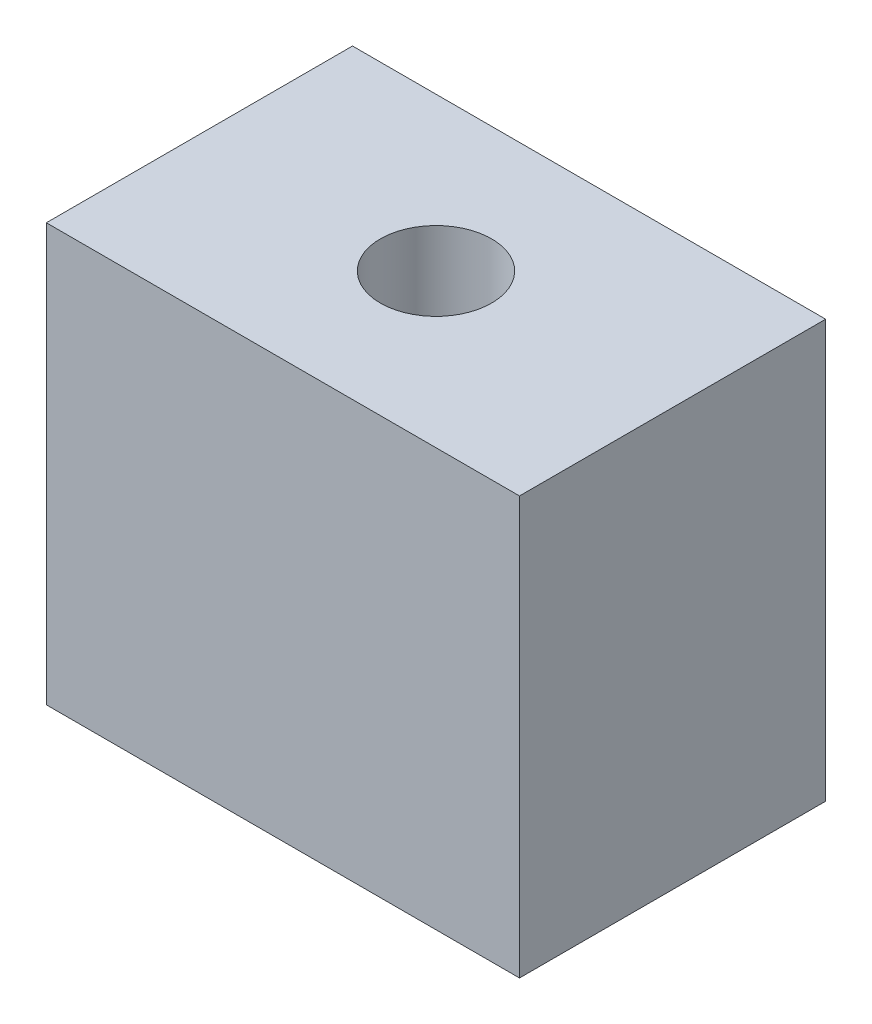
ISO-10303-21;
HEADER;
FILE_DESCRIPTION(('STEP AP214'),'2;1');
FILE_NAME('part.step','',(''),(''),'','','');
FILE_SCHEMA(('AUTOMOTIVE_DESIGN { 1 0 10303 214 1 1 1 1 }'));
ENDSEC;
DATA;
#1=APPLICATION_CONTEXT('core data for automotive mechanical design processes');
#2=APPLICATION_PROTOCOL_DEFINITION('international standard','automotive_design',2000,#1);
#3=PRODUCT_CONTEXT('',#1,'mechanical');
#4=PRODUCT('Part','Part','',(#3));
#5=PRODUCT_RELATED_PRODUCT_CATEGORY('part','',(#4));
#6=PRODUCT_DEFINITION_FORMATION('','',#4);
#7=PRODUCT_DEFINITION_CONTEXT('part definition',#1,'design');
#8=PRODUCT_DEFINITION('design','',#6,#7);
#9=PRODUCT_DEFINITION_SHAPE('','',#8);
#10=(LENGTH_UNIT() NAMED_UNIT(*) SI_UNIT(.MILLI.,.METRE.));
#11=(NAMED_UNIT(*) PLANE_ANGLE_UNIT() SI_UNIT($,.RADIAN.));
#12=(NAMED_UNIT(*) SI_UNIT($,.STERADIAN.) SOLID_ANGLE_UNIT());
#13=UNCERTAINTY_MEASURE_WITH_UNIT(LENGTH_MEASURE(1.E-05),#10,'distance_accuracy_value','');
#14=(GEOMETRIC_REPRESENTATION_CONTEXT(3) GLOBAL_UNCERTAINTY_ASSIGNED_CONTEXT((#13)) GLOBAL_UNIT_ASSIGNED_CONTEXT((#10,
#11,#12)) REPRESENTATION_CONTEXT('',''));
#15=CARTESIAN_POINT('',(0.,0.,0.));
#16=DIRECTION('',(0.,0.,1.));
#17=DIRECTION('',(1.,0.,0.));
#18=AXIS2_PLACEMENT_3D('',#15,#16,#17);
#19=CARTESIAN_POINT('',(17.,15.,22.));
#20=DIRECTION('',(-1.,0.,0.));
#21=DIRECTION('',(0.,-1.,0.));
#22=AXIS2_PLACEMENT_3D('',#19,#20,#21);
#23=PLANE('',#22);
#24=DIRECTION('',(0.,1.,0.));
#25=VECTOR('',#24,1.);
#26=CARTESIAN_POINT('',(17.,15.,0.));
#27=LINE('',#26,#25);
#28=CARTESIAN_POINT('',(17.,-15.,0.));
#29=VERTEX_POINT('',#28);
#30=CARTESIAN_POINT('',(17.,15.,0.));
#31=VERTEX_POINT('',#30);
#32=EDGE_CURVE('E94',#29,#31,#27,.T.);
#33=ORIENTED_EDGE('',*,*,#32,.T.);
#34=DIRECTION('',(0.,0.,-1.));
#35=VECTOR('',#34,1.);
#36=CARTESIAN_POINT('',(17.,15.,22.));
#37=LINE('',#36,#35);
#38=CARTESIAN_POINT('',(17.,15.,22.));
#39=VERTEX_POINT('',#38);
#40=EDGE_CURVE('E11',#39,#31,#37,.T.);
#41=ORIENTED_EDGE('',*,*,#40,.F.);
#42=DIRECTION('',(0.,1.,0.));
#43=VECTOR('',#42,1.);
#44=CARTESIAN_POINT('',(17.,15.,22.));
#45=LINE('',#44,#43);
#46=CARTESIAN_POINT('',(17.,-15.,22.));
#47=VERTEX_POINT('',#46);
#48=EDGE_CURVE('E82',#47,#39,#45,.T.);
#49=ORIENTED_EDGE('',*,*,#48,.F.);
#50=DIRECTION('',(0.,0.,-1.));
#51=VECTOR('',#50,1.);
#52=CARTESIAN_POINT('',(17.,-15.,22.));
#53=LINE('',#52,#51);
#54=EDGE_CURVE('E90',#47,#29,#53,.T.);
#55=ORIENTED_EDGE('',*,*,#54,.T.);
#56=EDGE_LOOP('',(#33,#41,#49,#55));
#57=FACE_BOUND('',#56,.T.);
#58=ADVANCED_FACE('F31',(#57),#23,.F.);
#59=CARTESIAN_POINT('',(-17.,15.,22.));
#60=DIRECTION('',(0.,-1.,0.));
#61=DIRECTION('',(0.,0.,-1.));
#62=AXIS2_PLACEMENT_3D('',#59,#60,#61);
#63=PLANE('',#62);
#64=CARTESIAN_POINT('',(0.,15.,11.));
#65=DIRECTION('',(0.,1.,0.));
#66=DIRECTION('',(0.,0.,1.));
#67=AXIS2_PLACEMENT_3D('',#64,#65,#66);
#68=CIRCLE('',#67,4.);
#69=CARTESIAN_POINT('',(0.,15.,15.));
#70=VERTEX_POINT('',#69);
#71=EDGE_CURVE('E108',#70,#70,#68,.T.);
#72=ORIENTED_EDGE('',*,*,#71,.F.);
#73=EDGE_LOOP('',(#72));
#74=FACE_BOUND('',#73,.T.);
#75=DIRECTION('',(-1.,0.,0.));
#76=VECTOR('',#75,1.);
#77=CARTESIAN_POINT('',(-17.,15.,0.));
#78=LINE('',#77,#76);
#79=CARTESIAN_POINT('',(-17.,15.,0.));
#80=VERTEX_POINT('',#79);
#81=EDGE_CURVE('E86',#31,#80,#78,.T.);
#82=ORIENTED_EDGE('',*,*,#81,.T.);
#83=DIRECTION('',(0.,0.,-1.));
#84=VECTOR('',#83,1.);
#85=CARTESIAN_POINT('',(-17.,15.,22.));
#86=LINE('',#85,#84);
#87=CARTESIAN_POINT('',(-17.,15.,22.));
#88=VERTEX_POINT('',#87);
#89=EDGE_CURVE('E39',#88,#80,#86,.T.);
#90=ORIENTED_EDGE('',*,*,#89,.F.);
#91=DIRECTION('',(-1.,0.,0.));
#92=VECTOR('',#91,1.);
#93=CARTESIAN_POINT('',(-17.,15.,22.));
#94=LINE('',#93,#92);
#95=EDGE_CURVE('E77',#39,#88,#94,.T.);
#96=ORIENTED_EDGE('',*,*,#95,.F.);
#97=ORIENTED_EDGE('',*,*,#40,.T.);
#98=EDGE_LOOP('',(#82,#90,#96,#97));
#99=FACE_BOUND('',#98,.T.);
#100=ADVANCED_FACE('F85',(#74,#99),#63,.F.);
#101=CARTESIAN_POINT('',(-17.,15.,22.));
#102=DIRECTION('',(1.,0.,0.));
#103=DIRECTION('',(0.,1.,0.));
#104=AXIS2_PLACEMENT_3D('',#101,#102,#103);
#105=PLANE('',#104);
#106=DIRECTION('',(0.,-1.,0.));
#107=VECTOR('',#106,1.);
#108=CARTESIAN_POINT('',(-17.,15.,0.));
#109=LINE('',#108,#107);
#110=CARTESIAN_POINT('',(-17.,-15.,0.));
#111=VERTEX_POINT('',#110);
#112=EDGE_CURVE('E64',#80,#111,#109,.T.);
#113=ORIENTED_EDGE('',*,*,#112,.T.);
#114=DIRECTION('',(0.,0.,-1.));
#115=VECTOR('',#114,1.);
#116=CARTESIAN_POINT('',(-17.,-15.,22.));
#117=LINE('',#116,#115);
#118=CARTESIAN_POINT('',(-17.,-15.,22.));
#119=VERTEX_POINT('',#118);
#120=EDGE_CURVE('E87',#119,#111,#117,.T.);
#121=ORIENTED_EDGE('',*,*,#120,.F.);
#122=DIRECTION('',(0.,-1.,0.));
#123=VECTOR('',#122,1.);
#124=CARTESIAN_POINT('',(-17.,15.,22.));
#125=LINE('',#124,#123);
#126=EDGE_CURVE('E80',#88,#119,#125,.T.);
#127=ORIENTED_EDGE('',*,*,#126,.F.);
#128=ORIENTED_EDGE('',*,*,#89,.T.);
#129=EDGE_LOOP('',(#113,#121,#127,#128));
#130=FACE_BOUND('',#129,.T.);
#131=ADVANCED_FACE('F88',(#130),#105,.F.);
#132=CARTESIAN_POINT('',(-17.,-15.,22.));
#133=DIRECTION('',(0.,1.,0.));
#134=DIRECTION('',(0.,0.,1.));
#135=AXIS2_PLACEMENT_3D('',#132,#133,#134);
#136=PLANE('',#135);
#137=CARTESIAN_POINT('',(0.,-15.,11.));
#138=DIRECTION('',(0.,1.,0.));
#139=DIRECTION('',(0.,0.,1.));
#140=AXIS2_PLACEMENT_3D('',#137,#138,#139);
#141=CIRCLE('',#140,4.);
#142=CARTESIAN_POINT('',(0.,-15.,15.));
#143=VERTEX_POINT('',#142);
#144=EDGE_CURVE('E97',#143,#143,#141,.T.);
#145=ORIENTED_EDGE('',*,*,#144,.T.);
#146=EDGE_LOOP('',(#145));
#147=FACE_BOUND('',#146,.T.);
#148=DIRECTION('',(1.,0.,0.));
#149=VECTOR('',#148,1.);
#150=CARTESIAN_POINT('',(-17.,-15.,0.));
#151=LINE('',#150,#149);
#152=EDGE_CURVE('E70',#111,#29,#151,.T.);
#153=ORIENTED_EDGE('',*,*,#152,.T.);
#154=ORIENTED_EDGE('',*,*,#54,.F.);
#155=DIRECTION('',(1.,0.,0.));
#156=VECTOR('',#155,1.);
#157=CARTESIAN_POINT('',(-17.,-15.,22.));
#158=LINE('',#157,#156);
#159=EDGE_CURVE('E47',#119,#47,#158,.T.);
#160=ORIENTED_EDGE('',*,*,#159,.F.);
#161=ORIENTED_EDGE('',*,*,#120,.T.);
#162=EDGE_LOOP('',(#153,#154,#160,#161));
#163=FACE_BOUND('',#162,.T.);
#164=ADVANCED_FACE('F102',(#147,#163),#136,.F.);
#165=CARTESIAN_POINT('',(17.,-15.,22.));
#166=DIRECTION('',(0.,0.,1.));
#167=DIRECTION('',(1.,0.,0.));
#168=AXIS2_PLACEMENT_3D('',#165,#166,#167);
#169=PLANE('',#168);
#170=ORIENTED_EDGE('',*,*,#48,.T.);
#171=ORIENTED_EDGE('',*,*,#95,.T.);
#172=ORIENTED_EDGE('',*,*,#126,.T.);
#173=ORIENTED_EDGE('',*,*,#159,.T.);
#174=EDGE_LOOP('',(#170,#171,#172,#173));
#175=FACE_BOUND('',#174,.T.);
#176=ADVANCED_FACE('F78',(#175),#169,.T.);
#177=CARTESIAN_POINT('',(17.,-15.,0.));
#178=DIRECTION('',(0.,0.,1.));
#179=DIRECTION('',(1.,0.,0.));
#180=AXIS2_PLACEMENT_3D('',#177,#178,#179);
#181=PLANE('',#180);
#182=ORIENTED_EDGE('',*,*,#32,.F.);
#183=ORIENTED_EDGE('',*,*,#152,.F.);
#184=ORIENTED_EDGE('',*,*,#112,.F.);
#185=ORIENTED_EDGE('',*,*,#81,.F.);
#186=EDGE_LOOP('',(#182,#183,#184,#185));
#187=FACE_BOUND('',#186,.T.);
#188=ADVANCED_FACE('F105',(#187),#181,.F.);
#189=CARTESIAN_POINT('',(0.,-15.,11.));
#190=DIRECTION('',(0.,1.,0.));
#191=DIRECTION('',(0.,0.,1.));
#192=AXIS2_PLACEMENT_3D('',#189,#190,#191);
#193=CYLINDRICAL_SURFACE('',#192,4.);
#194=ORIENTED_EDGE('',*,*,#144,.F.);
#195=EDGE_LOOP('',(#194));
#196=FACE_BOUND('',#195,.T.);
#197=ORIENTED_EDGE('',*,*,#71,.T.);
#198=EDGE_LOOP('',(#197));
#199=FACE_BOUND('',#198,.T.);
#200=ADVANCED_FACE('F115',(#196,#199),#193,.F.);
#201=CLOSED_SHELL('',(#58,#100,#131,#164,#176,#188,#200));
#202=MANIFOLD_SOLID_BREP('B2',#201);
#203=ADVANCED_BREP_SHAPE_REPRESENTATION('',(#18,#202),#14);
#204=SHAPE_DEFINITION_REPRESENTATION(#9,#203);
ENDSEC;
END-ISO-10303-21;
